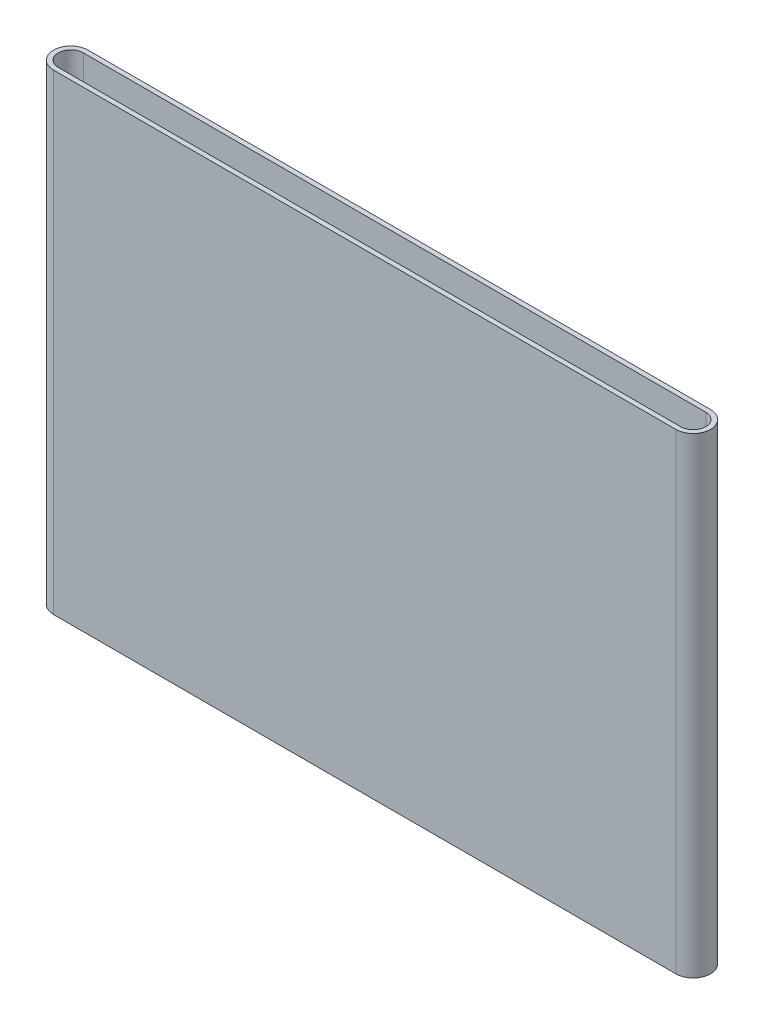
ISO-10303-21;
HEADER;
FILE_DESCRIPTION(('STEP AP214'),'2;1');
FILE_NAME('part.step','',(''),(''),'','','');
FILE_SCHEMA(('AUTOMOTIVE_DESIGN { 1 0 10303 214 1 1 1 1 }'));
ENDSEC;
DATA;
#1=APPLICATION_CONTEXT('core data for automotive mechanical design processes');
#2=APPLICATION_PROTOCOL_DEFINITION('international standard','automotive_design',2000,#1);
#3=PRODUCT_CONTEXT('',#1,'mechanical');
#4=PRODUCT('Part','Part','',(#3));
#5=PRODUCT_RELATED_PRODUCT_CATEGORY('part','',(#4));
#6=PRODUCT_DEFINITION_FORMATION('','',#4);
#7=PRODUCT_DEFINITION_CONTEXT('part definition',#1,'design');
#8=PRODUCT_DEFINITION('design','',#6,#7);
#9=PRODUCT_DEFINITION_SHAPE('','',#8);
#10=(LENGTH_UNIT() NAMED_UNIT(*) SI_UNIT(.MILLI.,.METRE.));
#11=(NAMED_UNIT(*) PLANE_ANGLE_UNIT() SI_UNIT($,.RADIAN.));
#12=(NAMED_UNIT(*) SI_UNIT($,.STERADIAN.) SOLID_ANGLE_UNIT());
#13=UNCERTAINTY_MEASURE_WITH_UNIT(LENGTH_MEASURE(1.E-05),#10,'distance_accuracy_value','');
#14=(GEOMETRIC_REPRESENTATION_CONTEXT(3) GLOBAL_UNCERTAINTY_ASSIGNED_CONTEXT((#13)) GLOBAL_UNIT_ASSIGNED_CONTEXT((#10,
#11,#12)) REPRESENTATION_CONTEXT('',''));
#15=CARTESIAN_POINT('',(0.,0.,0.));
#16=DIRECTION('',(0.,0.,1.));
#17=DIRECTION('',(1.,0.,0.));
#18=AXIS2_PLACEMENT_3D('',#15,#16,#17);
#19=CARTESIAN_POINT('',(-99.,150.,0.));
#20=DIRECTION('',(0.,1.,0.));
#21=DIRECTION('',(0.,0.,1.));
#22=AXIS2_PLACEMENT_3D('',#19,#20,#21);
#23=PLANE('',#22);
#24=CARTESIAN_POINT('',(-99.,150.,0.));
#25=DIRECTION('',(0.,1.,0.));
#26=DIRECTION('',(0.,0.,1.));
#27=AXIS2_PLACEMENT_3D('',#24,#25,#26);
#28=CIRCLE('',#27,5.5);
#29=CARTESIAN_POINT('',(-99.,150.,-5.5));
#30=VERTEX_POINT('',#29);
#31=CARTESIAN_POINT('',(-99.,150.,5.5));
#32=VERTEX_POINT('',#31);
#33=EDGE_CURVE('E136',#30,#32,#28,.T.);
#34=ORIENTED_EDGE('',*,*,#33,.T.);
#35=DIRECTION('',(1.,0.,0.));
#36=VECTOR('',#35,1.);
#37=CARTESIAN_POINT('',(-99.,150.,5.5));
#38=LINE('',#37,#36);
#39=CARTESIAN_POINT('',(99.,150.,5.5));
#40=VERTEX_POINT('',#39);
#41=EDGE_CURVE('E139',#32,#40,#38,.T.);
#42=ORIENTED_EDGE('',*,*,#41,.T.);
#43=CARTESIAN_POINT('',(99.,150.,0.));
#44=DIRECTION('',(0.,1.,0.));
#45=DIRECTION('',(0.,0.,1.));
#46=AXIS2_PLACEMENT_3D('',#43,#44,#45);
#47=CIRCLE('',#46,5.5);
#48=CARTESIAN_POINT('',(99.,150.,-5.5));
#49=VERTEX_POINT('',#48);
#50=EDGE_CURVE('E142',#40,#49,#47,.T.);
#51=ORIENTED_EDGE('',*,*,#50,.T.);
#52=DIRECTION('',(-1.,0.,0.));
#53=VECTOR('',#52,1.);
#54=CARTESIAN_POINT('',(-99.,150.,-5.5));
#55=LINE('',#54,#53);
#56=EDGE_CURVE('E144',#49,#30,#55,.T.);
#57=ORIENTED_EDGE('',*,*,#56,.T.);
#58=EDGE_LOOP('',(#34,#42,#51,#57));
#59=FACE_BOUND('',#58,.T.);
#60=DIRECTION('',(-1.,0.,0.));
#61=VECTOR('',#60,1.);
#62=CARTESIAN_POINT('',(-99.,150.,-4.));
#63=LINE('',#62,#61);
#64=CARTESIAN_POINT('',(99.,150.,-4.));
#65=VERTEX_POINT('',#64);
#66=CARTESIAN_POINT('',(-99.,150.,-4.));
#67=VERTEX_POINT('',#66);
#68=EDGE_CURVE('E108',#65,#67,#63,.T.);
#69=ORIENTED_EDGE('',*,*,#68,.F.);
#70=CARTESIAN_POINT('',(99.,150.,0.));
#71=DIRECTION('',(0.,1.,0.));
#72=DIRECTION('',(0.,0.,1.));
#73=AXIS2_PLACEMENT_3D('',#70,#71,#72);
#74=CIRCLE('',#73,4.);
#75=CARTESIAN_POINT('',(99.,150.,4.));
#76=VERTEX_POINT('',#75);
#77=EDGE_CURVE('E100',#76,#65,#74,.T.);
#78=ORIENTED_EDGE('',*,*,#77,.F.);
#79=DIRECTION('',(1.,0.,0.));
#80=VECTOR('',#79,1.);
#81=CARTESIAN_POINT('',(-99.,150.,4.));
#82=LINE('',#81,#80);
#83=CARTESIAN_POINT('',(-99.,150.,4.));
#84=VERTEX_POINT('',#83);
#85=EDGE_CURVE('E122',#84,#76,#82,.T.);
#86=ORIENTED_EDGE('',*,*,#85,.F.);
#87=CARTESIAN_POINT('',(-99.,150.,0.));
#88=DIRECTION('',(0.,1.,0.));
#89=DIRECTION('',(0.,0.,1.));
#90=AXIS2_PLACEMENT_3D('',#87,#88,#89);
#91=CIRCLE('',#90,4.);
#92=EDGE_CURVE('E120',#67,#84,#91,.T.);
#93=ORIENTED_EDGE('',*,*,#92,.F.);
#94=EDGE_LOOP('',(#69,#78,#86,#93));
#95=FACE_BOUND('',#94,.T.);
#96=ADVANCED_FACE('F35',(#59,#95),#23,.T.);
#97=CARTESIAN_POINT('',(-99.,0.,0.));
#98=DIRECTION('',(0.,1.,0.));
#99=DIRECTION('',(0.,0.,1.));
#100=AXIS2_PLACEMENT_3D('',#97,#98,#99);
#101=PLANE('',#100);
#102=CARTESIAN_POINT('',(-99.,0.,0.));
#103=DIRECTION('',(0.,1.,0.));
#104=DIRECTION('',(0.,0.,1.));
#105=AXIS2_PLACEMENT_3D('',#102,#103,#104);
#106=CIRCLE('',#105,5.5);
#107=CARTESIAN_POINT('',(-99.,0.,-5.5));
#108=VERTEX_POINT('',#107);
#109=CARTESIAN_POINT('',(-99.,0.,5.5));
#110=VERTEX_POINT('',#109);
#111=EDGE_CURVE('E116',#108,#110,#106,.T.);
#112=ORIENTED_EDGE('',*,*,#111,.F.);
#113=DIRECTION('',(-1.,0.,0.));
#114=VECTOR('',#113,1.);
#115=CARTESIAN_POINT('',(-99.,0.,-5.5));
#116=LINE('',#115,#114);
#117=CARTESIAN_POINT('',(99.,0.,-5.5));
#118=VERTEX_POINT('',#117);
#119=EDGE_CURVE('E140',#118,#108,#116,.T.);
#120=ORIENTED_EDGE('',*,*,#119,.F.);
#121=CARTESIAN_POINT('',(99.,0.,0.));
#122=DIRECTION('',(0.,1.,0.));
#123=DIRECTION('',(0.,0.,1.));
#124=AXIS2_PLACEMENT_3D('',#121,#122,#123);
#125=CIRCLE('',#124,5.5);
#126=CARTESIAN_POINT('',(99.,0.,5.5));
#127=VERTEX_POINT('',#126);
#128=EDGE_CURVE('E151',#127,#118,#125,.T.);
#129=ORIENTED_EDGE('',*,*,#128,.F.);
#130=DIRECTION('',(1.,0.,0.));
#131=VECTOR('',#130,1.);
#132=CARTESIAN_POINT('',(-99.,0.,5.5));
#133=LINE('',#132,#131);
#134=EDGE_CURVE('E149',#110,#127,#133,.T.);
#135=ORIENTED_EDGE('',*,*,#134,.F.);
#136=EDGE_LOOP('',(#112,#120,#129,#135));
#137=FACE_BOUND('',#136,.T.);
#138=CARTESIAN_POINT('',(99.,0.,0.));
#139=DIRECTION('',(0.,1.,0.));
#140=DIRECTION('',(0.,0.,1.));
#141=AXIS2_PLACEMENT_3D('',#138,#139,#140);
#142=CIRCLE('',#141,4.);
#143=CARTESIAN_POINT('',(99.,0.,4.));
#144=VERTEX_POINT('',#143);
#145=CARTESIAN_POINT('',(99.,0.,-4.));
#146=VERTEX_POINT('',#145);
#147=EDGE_CURVE('E58',#144,#146,#142,.T.);
#148=ORIENTED_EDGE('',*,*,#147,.T.);
#149=DIRECTION('',(-1.,0.,0.));
#150=VECTOR('',#149,1.);
#151=CARTESIAN_POINT('',(-99.,0.,-4.));
#152=LINE('',#151,#150);
#153=CARTESIAN_POINT('',(-99.,0.,-4.));
#154=VERTEX_POINT('',#153);
#155=EDGE_CURVE('E115',#146,#154,#152,.T.);
#156=ORIENTED_EDGE('',*,*,#155,.T.);
#157=CARTESIAN_POINT('',(-99.,0.,0.));
#158=DIRECTION('',(0.,1.,0.));
#159=DIRECTION('',(0.,0.,1.));
#160=AXIS2_PLACEMENT_3D('',#157,#158,#159);
#161=CIRCLE('',#160,4.);
#162=CARTESIAN_POINT('',(-99.,0.,4.));
#163=VERTEX_POINT('',#162);
#164=EDGE_CURVE('E128',#154,#163,#161,.T.);
#165=ORIENTED_EDGE('',*,*,#164,.T.);
#166=DIRECTION('',(1.,0.,0.));
#167=VECTOR('',#166,1.);
#168=CARTESIAN_POINT('',(-99.,0.,4.));
#169=LINE('',#168,#167);
#170=EDGE_CURVE('E109',#163,#144,#169,.T.);
#171=ORIENTED_EDGE('',*,*,#170,.T.);
#172=EDGE_LOOP('',(#148,#156,#165,#171));
#173=FACE_BOUND('',#172,.T.);
#174=ADVANCED_FACE('F169',(#137,#173),#101,.F.);
#175=CARTESIAN_POINT('',(-99.,150.,0.));
#176=DIRECTION('',(0.,-1.,0.));
#177=DIRECTION('',(0.,0.,-1.));
#178=AXIS2_PLACEMENT_3D('',#175,#176,#177);
#179=CYLINDRICAL_SURFACE('',#178,5.5);
#180=ORIENTED_EDGE('',*,*,#111,.T.);
#181=DIRECTION('',(0.,-1.,0.));
#182=VECTOR('',#181,1.);
#183=CARTESIAN_POINT('',(-99.,150.,5.5));
#184=LINE('',#183,#182);
#185=EDGE_CURVE('E11',#32,#110,#184,.T.);
#186=ORIENTED_EDGE('',*,*,#185,.F.);
#187=ORIENTED_EDGE('',*,*,#33,.F.);
#188=DIRECTION('',(0.,-1.,0.));
#189=VECTOR('',#188,1.);
#190=CARTESIAN_POINT('',(-99.,150.,-5.5));
#191=LINE('',#190,#189);
#192=EDGE_CURVE('E146',#30,#108,#191,.T.);
#193=ORIENTED_EDGE('',*,*,#192,.T.);
#194=EDGE_LOOP('',(#180,#186,#187,#193));
#195=FACE_BOUND('',#194,.T.);
#196=ADVANCED_FACE('F37',(#195),#179,.T.);
#197=CARTESIAN_POINT('',(-99.,150.,5.5));
#198=DIRECTION('',(0.,0.,-1.));
#199=DIRECTION('',(-1.,0.,0.));
#200=AXIS2_PLACEMENT_3D('',#197,#198,#199);
#201=PLANE('',#200);
#202=ORIENTED_EDGE('',*,*,#134,.T.);
#203=DIRECTION('',(0.,-1.,0.));
#204=VECTOR('',#203,1.);
#205=CARTESIAN_POINT('',(99.,150.,5.5));
#206=LINE('',#205,#204);
#207=EDGE_CURVE('E43',#40,#127,#206,.T.);
#208=ORIENTED_EDGE('',*,*,#207,.F.);
#209=ORIENTED_EDGE('',*,*,#41,.F.);
#210=ORIENTED_EDGE('',*,*,#185,.T.);
#211=EDGE_LOOP('',(#202,#208,#209,#210));
#212=FACE_BOUND('',#211,.T.);
#213=ADVANCED_FACE('F179',(#212),#201,.F.);
#214=CARTESIAN_POINT('',(99.,150.,0.));
#215=DIRECTION('',(0.,-1.,0.));
#216=DIRECTION('',(0.,0.,-1.));
#217=AXIS2_PLACEMENT_3D('',#214,#215,#216);
#218=CYLINDRICAL_SURFACE('',#217,5.5);
#219=ORIENTED_EDGE('',*,*,#128,.T.);
#220=DIRECTION('',(0.,-1.,0.));
#221=VECTOR('',#220,1.);
#222=CARTESIAN_POINT('',(99.,150.,-5.5));
#223=LINE('',#222,#221);
#224=EDGE_CURVE('E156',#49,#118,#223,.T.);
#225=ORIENTED_EDGE('',*,*,#224,.F.);
#226=ORIENTED_EDGE('',*,*,#50,.F.);
#227=ORIENTED_EDGE('',*,*,#207,.T.);
#228=EDGE_LOOP('',(#219,#225,#226,#227));
#229=FACE_BOUND('',#228,.T.);
#230=ADVANCED_FACE('F163',(#229),#218,.T.);
#231=CARTESIAN_POINT('',(-99.,150.,-5.5));
#232=DIRECTION('',(0.,0.,1.));
#233=DIRECTION('',(1.,0.,0.));
#234=AXIS2_PLACEMENT_3D('',#231,#232,#233);
#235=PLANE('',#234);
#236=ORIENTED_EDGE('',*,*,#119,.T.);
#237=ORIENTED_EDGE('',*,*,#192,.F.);
#238=ORIENTED_EDGE('',*,*,#56,.F.);
#239=ORIENTED_EDGE('',*,*,#224,.T.);
#240=EDGE_LOOP('',(#236,#237,#238,#239));
#241=FACE_BOUND('',#240,.T.);
#242=ADVANCED_FACE('F173',(#241),#235,.F.);
#243=CARTESIAN_POINT('',(99.,150.,0.));
#244=DIRECTION('',(0.,-1.,0.));
#245=DIRECTION('',(0.,0.,-1.));
#246=AXIS2_PLACEMENT_3D('',#243,#244,#245);
#247=CYLINDRICAL_SURFACE('',#246,4.);
#248=ORIENTED_EDGE('',*,*,#147,.F.);
#249=DIRECTION('',(0.,-1.,0.));
#250=VECTOR('',#249,1.);
#251=CARTESIAN_POINT('',(99.,150.,4.));
#252=LINE('',#251,#250);
#253=EDGE_CURVE('E104',#76,#144,#252,.T.);
#254=ORIENTED_EDGE('',*,*,#253,.F.);
#255=ORIENTED_EDGE('',*,*,#77,.T.);
#256=DIRECTION('',(0.,-1.,0.));
#257=VECTOR('',#256,1.);
#258=CARTESIAN_POINT('',(99.,150.,-4.));
#259=LINE('',#258,#257);
#260=EDGE_CURVE('E103',#65,#146,#259,.T.);
#261=ORIENTED_EDGE('',*,*,#260,.T.);
#262=EDGE_LOOP('',(#248,#254,#255,#261));
#263=FACE_BOUND('',#262,.T.);
#264=ADVANCED_FACE('F102',(#263),#247,.F.);
#265=CARTESIAN_POINT('',(-99.,150.,-4.));
#266=DIRECTION('',(0.,0.,1.));
#267=DIRECTION('',(1.,0.,0.));
#268=AXIS2_PLACEMENT_3D('',#265,#266,#267);
#269=PLANE('',#268);
#270=ORIENTED_EDGE('',*,*,#155,.F.);
#271=ORIENTED_EDGE('',*,*,#260,.F.);
#272=ORIENTED_EDGE('',*,*,#68,.T.);
#273=DIRECTION('',(0.,-1.,0.));
#274=VECTOR('',#273,1.);
#275=CARTESIAN_POINT('',(-99.,150.,-4.));
#276=LINE('',#275,#274);
#277=EDGE_CURVE('E117',#67,#154,#276,.T.);
#278=ORIENTED_EDGE('',*,*,#277,.T.);
#279=EDGE_LOOP('',(#270,#271,#272,#278));
#280=FACE_BOUND('',#279,.T.);
#281=ADVANCED_FACE('F112',(#280),#269,.T.);
#282=CARTESIAN_POINT('',(-99.,150.,0.));
#283=DIRECTION('',(0.,-1.,0.));
#284=DIRECTION('',(0.,0.,-1.));
#285=AXIS2_PLACEMENT_3D('',#282,#283,#284);
#286=CYLINDRICAL_SURFACE('',#285,4.);
#287=ORIENTED_EDGE('',*,*,#164,.F.);
#288=ORIENTED_EDGE('',*,*,#277,.F.);
#289=ORIENTED_EDGE('',*,*,#92,.T.);
#290=DIRECTION('',(0.,-1.,0.));
#291=VECTOR('',#290,1.);
#292=CARTESIAN_POINT('',(-99.,150.,4.));
#293=LINE('',#292,#291);
#294=EDGE_CURVE('E50',#84,#163,#293,.T.);
#295=ORIENTED_EDGE('',*,*,#294,.T.);
#296=EDGE_LOOP('',(#287,#288,#289,#295));
#297=FACE_BOUND('',#296,.T.);
#298=ADVANCED_FACE('F202',(#297),#286,.F.);
#299=CARTESIAN_POINT('',(-99.,150.,4.));
#300=DIRECTION('',(0.,0.,-1.));
#301=DIRECTION('',(-1.,0.,0.));
#302=AXIS2_PLACEMENT_3D('',#299,#300,#301);
#303=PLANE('',#302);
#304=ORIENTED_EDGE('',*,*,#170,.F.);
#305=ORIENTED_EDGE('',*,*,#294,.F.);
#306=ORIENTED_EDGE('',*,*,#85,.T.);
#307=ORIENTED_EDGE('',*,*,#253,.T.);
#308=EDGE_LOOP('',(#304,#305,#306,#307));
#309=FACE_BOUND('',#308,.T.);
#310=ADVANCED_FACE('F206',(#309),#303,.T.);
#311=CLOSED_SHELL('',(#96,#174,#196,#213,#230,#242,#264,#281,#298,#310));
#312=MANIFOLD_SOLID_BREP('B2',#311);
#313=ADVANCED_BREP_SHAPE_REPRESENTATION('',(#18,#312),#14);
#314=SHAPE_DEFINITION_REPRESENTATION(#9,#313);
ENDSEC;
END-ISO-10303-21;
